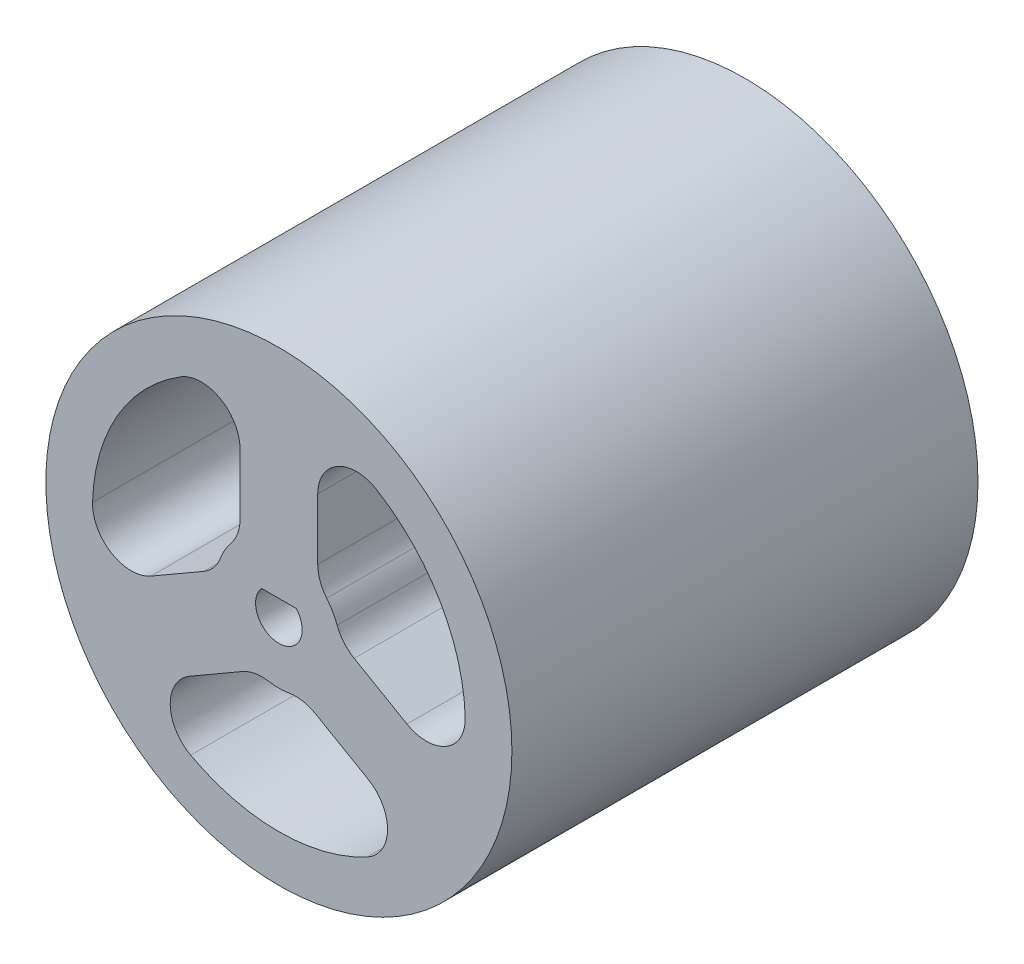
ISO-10303-21;
HEADER;
FILE_DESCRIPTION(('STEP AP214'),'2;1');
FILE_NAME('part.step','',(''),(''),'','','');
FILE_SCHEMA(('AUTOMOTIVE_DESIGN { 1 0 10303 214 1 1 1 1 }'));
ENDSEC;
DATA;
#1=APPLICATION_CONTEXT('core data for automotive mechanical design processes');
#2=APPLICATION_PROTOCOL_DEFINITION('international standard','automotive_design',2000,#1);
#3=PRODUCT_CONTEXT('',#1,'mechanical');
#4=PRODUCT('Part','Part','',(#3));
#5=PRODUCT_RELATED_PRODUCT_CATEGORY('part','',(#4));
#6=PRODUCT_DEFINITION_FORMATION('','',#4);
#7=PRODUCT_DEFINITION_CONTEXT('part definition',#1,'design');
#8=PRODUCT_DEFINITION('design','',#6,#7);
#9=PRODUCT_DEFINITION_SHAPE('','',#8);
#10=(LENGTH_UNIT() NAMED_UNIT(*) SI_UNIT(.MILLI.,.METRE.));
#11=(NAMED_UNIT(*) PLANE_ANGLE_UNIT() SI_UNIT($,.RADIAN.));
#12=(NAMED_UNIT(*) SI_UNIT($,.STERADIAN.) SOLID_ANGLE_UNIT());
#13=UNCERTAINTY_MEASURE_WITH_UNIT(LENGTH_MEASURE(1.E-05),#10,'distance_accuracy_value','');
#14=(GEOMETRIC_REPRESENTATION_CONTEXT(3) GLOBAL_UNCERTAINTY_ASSIGNED_CONTEXT((#13)) GLOBAL_UNIT_ASSIGNED_CONTEXT((#10,
#11,#12)) REPRESENTATION_CONTEXT('',''));
#15=CARTESIAN_POINT('',(0.,0.,0.));
#16=DIRECTION('',(0.,0.,1.));
#17=DIRECTION('',(1.,0.,0.));
#18=AXIS2_PLACEMENT_3D('',#15,#16,#17);
#19=CARTESIAN_POINT('',(0.,0.,60.));
#20=DIRECTION('',(0.,0.,1.));
#21=DIRECTION('',(1.,0.,0.));
#22=AXIS2_PLACEMENT_3D('',#19,#20,#21);
#23=PLANE('',#22);
#24=DIRECTION('',(-0.86602540378443,-0.500000000000014,0.));
#25=VECTOR('',#24,1.);
#26=CARTESIAN_POINT('',(2.49999999999999,-4.33012701892201,60.));
#27=LINE('',#26,#25);
#28=CARTESIAN_POINT('',(-4.6937472849692,-8.48343895038127,60.));
#29=VERTEX_POINT('',#28);
#30=CARTESIAN_POINT('',(-11.4910685796332,-12.407874229624,60.));
#31=VERTEX_POINT('',#30);
#32=EDGE_CURVE('E560',#29,#31,#27,.T.);
#33=ORIENTED_EDGE('',*,*,#32,.F.);
#34=CARTESIAN_POINT('',(-2.19374728496912,-12.8135659693034,60.));
#35=DIRECTION('',(0.,0.,1.));
#36=DIRECTION('',(1.,0.,0.));
#37=AXIS2_PLACEMENT_3D('',#34,#35,#36);
#38=CIRCLE('',#37,5.);
#39=CARTESIAN_POINT('',(-1.34999832921177,-7.88527136572518,60.));
#40=VERTEX_POINT('',#39);
#41=EDGE_CURVE('E348',#29,#40,#38,.F.);
#42=ORIENTED_EDGE('',*,*,#41,.T.);
#43=CARTESIAN_POINT('',(0.,0.,60.));
#44=DIRECTION('',(0.,0.,1.));
#45=DIRECTION('',(1.,0.,0.));
#46=AXIS2_PLACEMENT_3D('',#43,#44,#45);
#47=CIRCLE('',#46,8.);
#48=CARTESIAN_POINT('',(1.34999832921178,-7.88527136572518,60.));
#49=VERTEX_POINT('',#48);
#50=EDGE_CURVE('E570',#40,#49,#47,.T.);
#51=ORIENTED_EDGE('',*,*,#50,.T.);
#52=CARTESIAN_POINT('',(2.19374728496914,-12.8135659693034,60.));
#53=DIRECTION('',(0.,0.,1.));
#54=DIRECTION('',(1.,0.,0.));
#55=AXIS2_PLACEMENT_3D('',#52,#53,#54);
#56=CIRCLE('',#55,5.);
#57=CARTESIAN_POINT('',(4.69374728496899,-8.48343895038113,60.));
#58=VERTEX_POINT('',#57);
#59=EDGE_CURVE('E342',#49,#58,#56,.F.);
#60=ORIENTED_EDGE('',*,*,#59,.T.);
#61=DIRECTION('',(0.866025403784457,-0.499999999999969,0.));
#62=VECTOR('',#61,1.);
#63=CARTESIAN_POINT('',(-2.49999999999997,-4.3301270189225,60.));
#64=LINE('',#63,#62);
#65=CARTESIAN_POINT('',(11.4910685796334,-12.4078742296237,60.));
#66=VERTEX_POINT('',#65);
#67=EDGE_CURVE('E568',#58,#66,#64,.T.);
#68=ORIENTED_EDGE('',*,*,#67,.T.);
#69=CARTESIAN_POINT('',(8.99106857963356,-16.738001248546,60.));
#70=DIRECTION('',(0.,0.,1.));
#71=DIRECTION('',(1.,0.,0.));
#72=AXIS2_PLACEMENT_3D('',#69,#70,#71);
#73=CIRCLE('',#72,5.);
#74=CARTESIAN_POINT('',(11.3571392584845,-21.142738419216,60.));
#75=VERTEX_POINT('',#74);
#76=EDGE_CURVE('E384',#66,#75,#73,.F.);
#77=ORIENTED_EDGE('',*,*,#76,.T.);
#78=CARTESIAN_POINT('',(0.,0.,60.));
#79=DIRECTION('',(0.,0.,1.));
#80=DIRECTION('',(1.,0.,0.));
#81=AXIS2_PLACEMENT_3D('',#78,#79,#80);
#82=CIRCLE('',#81,24.);
#83=CARTESIAN_POINT('',(-11.3571392584839,-21.1427384192163,60.));
#84=VERTEX_POINT('',#83);
#85=EDGE_CURVE('E564',#84,#75,#82,.T.);
#86=ORIENTED_EDGE('',*,*,#85,.F.);
#87=CARTESIAN_POINT('',(-8.99106857963311,-16.7380012485462,60.));
#88=DIRECTION('',(0.,0.,1.));
#89=DIRECTION('',(1.,0.,0.));
#90=AXIS2_PLACEMENT_3D('',#87,#88,#89);
#91=CIRCLE('',#90,5.);
#92=EDGE_CURVE('E390',#84,#31,#91,.F.);
#93=ORIENTED_EDGE('',*,*,#92,.T.);
#94=EDGE_LOOP('',(#33,#42,#51,#60,#68,#77,#86,#93));
#95=FACE_BOUND('',#94,.T.);
#96=DIRECTION('',(0.866025403784456,-0.499999999999969,0.));
#97=VECTOR('',#96,1.);
#98=CARTESIAN_POINT('',(2.49999999999972,4.33012701892206,60.));
#99=LINE('',#98,#97);
#100=CARTESIAN_POINT('',(9.69374728496921,0.176815087463132,60.));
#101=VERTEX_POINT('',#100);
#102=CARTESIAN_POINT('',(16.4910685796334,-3.74762019177927,60.));
#103=VERTEX_POINT('',#102);
#104=EDGE_CURVE('E554',#101,#103,#99,.T.);
#105=ORIENTED_EDGE('',*,*,#104,.F.);
#106=CARTESIAN_POINT('',(12.1937472849691,4.50694210638541,60.));
#107=DIRECTION('',(0.,0.,1.));
#108=DIRECTION('',(1.,0.,0.));
#109=AXIS2_PLACEMENT_3D('',#106,#107,#108);
#110=CIRCLE('',#109,5.);
#111=CARTESIAN_POINT('',(7.50384448305788,2.77350283469872,60.));
#112=VERTEX_POINT('',#111);
#113=EDGE_CURVE('E372',#101,#112,#110,.F.);
#114=ORIENTED_EDGE('',*,*,#113,.T.);
#115=CARTESIAN_POINT('',(0.,0.,60.));
#116=DIRECTION('',(0.,0.,1.));
#117=DIRECTION('',(1.,0.,0.));
#118=AXIS2_PLACEMENT_3D('',#115,#116,#117);
#119=CIRCLE('',#118,8.);
#120=CARTESIAN_POINT('',(6.15384615384616,5.11176853102651,60.));
#121=VERTEX_POINT('',#120);
#122=EDGE_CURVE('E579',#112,#121,#119,.T.);
#123=ORIENTED_EDGE('',*,*,#122,.T.);
#124=CARTESIAN_POINT('',(10.,8.30662386291807,60.));
#125=DIRECTION('',(0.,0.,1.));
#126=DIRECTION('',(1.,0.,0.));
#127=AXIS2_PLACEMENT_3D('',#124,#125,#126);
#128=CIRCLE('',#127,5.);
#129=CARTESIAN_POINT('',(5.,8.30662386291807,60.));
#130=VERTEX_POINT('',#129);
#131=EDGE_CURVE('E366',#121,#130,#128,.F.);
#132=ORIENTED_EDGE('',*,*,#131,.T.);
#133=DIRECTION('',(0.,1.,0.));
#134=VECTOR('',#133,1.);
#135=CARTESIAN_POINT('',(5.,0.,60.));
#136=LINE('',#135,#134);
#137=CARTESIAN_POINT('',(5.,16.1554944214035,60.));
#138=VERTEX_POINT('',#137);
#139=EDGE_CURVE('E584',#130,#138,#136,.T.);
#140=ORIENTED_EDGE('',*,*,#139,.T.);
#141=CARTESIAN_POINT('',(10.,16.1554944214035,60.));
#142=DIRECTION('',(0.,0.,1.));
#143=DIRECTION('',(1.,0.,0.));
#144=AXIS2_PLACEMENT_3D('',#141,#142,#143);
#145=CIRCLE('',#144,5.);
#146=CARTESIAN_POINT('',(12.6315789473684,20.4069403217729,60.));
#147=VERTEX_POINT('',#146);
#148=EDGE_CURVE('E402',#138,#147,#145,.F.);
#149=ORIENTED_EDGE('',*,*,#148,.T.);
#150=CARTESIAN_POINT('',(0.,0.,60.));
#151=DIRECTION('',(0.,0.,1.));
#152=DIRECTION('',(1.,0.,0.));
#153=AXIS2_PLACEMENT_3D('',#150,#151,#152);
#154=CIRCLE('',#153,24.);
#155=CARTESIAN_POINT('',(23.9887182058525,0.735798097443807,60.));
#156=VERTEX_POINT('',#155);
#157=EDGE_CURVE('E588',#156,#147,#154,.T.);
#158=ORIENTED_EDGE('',*,*,#157,.F.);
#159=CARTESIAN_POINT('',(18.9910685796332,0.582506827143014,60.));
#160=DIRECTION('',(0.,0.,1.));
#161=DIRECTION('',(1.,0.,0.));
#162=AXIS2_PLACEMENT_3D('',#159,#160,#161);
#163=CIRCLE('',#162,5.);
#164=EDGE_CURVE('E378',#156,#103,#163,.F.);
#165=ORIENTED_EDGE('',*,*,#164,.T.);
#166=EDGE_LOOP('',(#105,#114,#123,#132,#140,#149,#158,#165));
#167=FACE_BOUND('',#166,.T.);
#168=DIRECTION('',(0.,1.,0.));
#169=VECTOR('',#168,1.);
#170=CARTESIAN_POINT('',(-5.,0.,60.));
#171=LINE('',#170,#169);
#172=CARTESIAN_POINT('',(-5.,8.30662386291808,60.));
#173=VERTEX_POINT('',#172);
#174=CARTESIAN_POINT('',(-5.,16.1554944214035,60.));
#175=VERTEX_POINT('',#174);
#176=EDGE_CURVE('E413',#173,#175,#171,.T.);
#177=ORIENTED_EDGE('',*,*,#176,.F.);
#178=CARTESIAN_POINT('',(-10.,8.30662386291808,60.));
#179=DIRECTION('',(0.,0.,1.));
#180=DIRECTION('',(1.,0.,0.));
#181=AXIS2_PLACEMENT_3D('',#178,#179,#180);
#182=CIRCLE('',#181,5.);
#183=CARTESIAN_POINT('',(-6.15384615384615,5.11176853102651,60.));
#184=VERTEX_POINT('',#183);
#185=EDGE_CURVE('E354',#173,#184,#182,.F.);
#186=ORIENTED_EDGE('',*,*,#185,.T.);
#187=CARTESIAN_POINT('',(0.,0.,60.));
#188=DIRECTION('',(0.,0.,1.));
#189=DIRECTION('',(1.,0.,0.));
#190=AXIS2_PLACEMENT_3D('',#187,#188,#189);
#191=CIRCLE('',#190,8.);
#192=CARTESIAN_POINT('',(-7.50384448305787,2.77350283469875,60.));
#193=VERTEX_POINT('',#192);
#194=EDGE_CURVE('E436',#184,#193,#191,.T.);
#195=ORIENTED_EDGE('',*,*,#194,.T.);
#196=CARTESIAN_POINT('',(-12.193747284969,4.50694210638546,60.));
#197=DIRECTION('',(0.,0.,1.));
#198=DIRECTION('',(1.,0.,0.));
#199=AXIS2_PLACEMENT_3D('',#196,#197,#198);
#200=CIRCLE('',#199,5.);
#201=CARTESIAN_POINT('',(-9.69374728496908,0.176815087463247,60.));
#202=VERTEX_POINT('',#201);
#203=EDGE_CURVE('E360',#193,#202,#200,.F.);
#204=ORIENTED_EDGE('',*,*,#203,.T.);
#205=DIRECTION('',(-0.866025403784443,-0.499999999999992,0.));
#206=VECTOR('',#205,1.);
#207=CARTESIAN_POINT('',(-2.49999999999996,4.33012701892222,60.));
#208=LINE('',#207,#206);
#209=CARTESIAN_POINT('',(-16.4910685796333,-3.74762019177941,60.));
#210=VERTEX_POINT('',#209);
#211=EDGE_CURVE('E445',#202,#210,#208,.T.);
#212=ORIENTED_EDGE('',*,*,#211,.T.);
#213=CARTESIAN_POINT('',(-18.9910685796332,0.582506827142809,60.));
#214=DIRECTION('',(0.,0.,1.));
#215=DIRECTION('',(1.,0.,0.));
#216=AXIS2_PLACEMENT_3D('',#213,#214,#215);
#217=CIRCLE('',#216,5.);
#218=CARTESIAN_POINT('',(-23.9887182058525,0.735798097443548,60.));
#219=VERTEX_POINT('',#218);
#220=EDGE_CURVE('E396',#210,#219,#217,.F.);
#221=ORIENTED_EDGE('',*,*,#220,.T.);
#222=CARTESIAN_POINT('',(0.,0.,60.));
#223=DIRECTION('',(0.,0.,1.));
#224=DIRECTION('',(1.,0.,0.));
#225=AXIS2_PLACEMENT_3D('',#222,#223,#224);
#226=CIRCLE('',#225,24.);
#227=CARTESIAN_POINT('',(-12.6315789473684,20.4069403217729,60.));
#228=VERTEX_POINT('',#227);
#229=EDGE_CURVE('E414',#228,#219,#226,.T.);
#230=ORIENTED_EDGE('',*,*,#229,.F.);
#231=CARTESIAN_POINT('',(-10.,16.1554944214035,60.));
#232=DIRECTION('',(0.,0.,1.));
#233=DIRECTION('',(1.,0.,0.));
#234=AXIS2_PLACEMENT_3D('',#231,#232,#233);
#235=CIRCLE('',#234,5.);
#236=EDGE_CURVE('E54',#228,#175,#235,.F.);
#237=ORIENTED_EDGE('',*,*,#236,.T.);
#238=EDGE_LOOP('',(#177,#186,#195,#204,#212,#221,#230,#237));
#239=FACE_BOUND('',#238,.T.);
#240=CARTESIAN_POINT('',(0.,0.,60.));
#241=DIRECTION('',(0.,0.,1.));
#242=DIRECTION('',(1.,0.,0.));
#243=AXIS2_PLACEMENT_3D('',#240,#241,#242);
#244=CIRCLE('',#243,30.);
#245=CARTESIAN_POINT('',(30.,0.,60.));
#246=VERTEX_POINT('',#245);
#247=EDGE_CURVE('E247',#246,#246,#244,.T.);
#248=ORIENTED_EDGE('',*,*,#247,.T.);
#249=EDGE_LOOP('',(#248));
#250=FACE_BOUND('',#249,.T.);
#251=CARTESIAN_POINT('',(0.,0.,60.));
#252=DIRECTION('',(0.,0.,1.));
#253=DIRECTION('',(1.,0.,0.));
#254=AXIS2_PLACEMENT_3D('',#251,#252,#253);
#255=CIRCLE('',#254,3.);
#256=CARTESIAN_POINT('',(-2.22436752780713,2.01300499284954,60.));
#257=VERTEX_POINT('',#256);
#258=CARTESIAN_POINT('',(2.22436752780713,2.01300499284954,60.));
#259=VERTEX_POINT('',#258);
#260=EDGE_CURVE('E251',#257,#259,#255,.T.);
#261=ORIENTED_EDGE('',*,*,#260,.F.);
#262=DIRECTION('',(1.,0.,0.));
#263=VECTOR('',#262,1.);
#264=CARTESIAN_POINT('',(0.,2.01300499284954,60.));
#265=LINE('',#264,#263);
#266=EDGE_CURVE('E225',#257,#259,#265,.T.);
#267=ORIENTED_EDGE('',*,*,#266,.T.);
#268=EDGE_LOOP('',(#261,#267));
#269=FACE_BOUND('',#268,.T.);
#270=ADVANCED_FACE('F45',(#95,#167,#239,#250,#269),#23,.T.);
#271=CARTESIAN_POINT('',(0.,0.,60.));
#272=DIRECTION('',(0.,0.,-1.));
#273=DIRECTION('',(-1.,0.,0.));
#274=AXIS2_PLACEMENT_3D('',#271,#272,#273);
#275=CYLINDRICAL_SURFACE('',#274,30.);
#276=ORIENTED_EDGE('',*,*,#247,.F.);
#277=EDGE_LOOP('',(#276));
#278=FACE_BOUND('',#277,.T.);
#279=CARTESIAN_POINT('',(0.,0.,0.));
#280=DIRECTION('',(0.,0.,1.));
#281=DIRECTION('',(1.,0.,0.));
#282=AXIS2_PLACEMENT_3D('',#279,#280,#281);
#283=CIRCLE('',#282,30.);
#284=CARTESIAN_POINT('',(30.,0.,0.));
#285=VERTEX_POINT('',#284);
#286=EDGE_CURVE('E246',#285,#285,#283,.T.);
#287=ORIENTED_EDGE('',*,*,#286,.T.);
#288=EDGE_LOOP('',(#287));
#289=FACE_BOUND('',#288,.T.);
#290=ADVANCED_FACE('F485',(#278,#289),#275,.T.);
#291=CARTESIAN_POINT('',(0.,0.,0.));
#292=DIRECTION('',(0.,0.,1.));
#293=DIRECTION('',(1.,0.,0.));
#294=AXIS2_PLACEMENT_3D('',#291,#292,#293);
#295=PLANE('',#294);
#296=CARTESIAN_POINT('',(0.,0.,0.));
#297=DIRECTION('',(0.,0.,1.));
#298=DIRECTION('',(1.,0.,0.));
#299=AXIS2_PLACEMENT_3D('',#296,#297,#298);
#300=CIRCLE('',#299,8.);
#301=CARTESIAN_POINT('',(-1.34999832921177,-7.88527136572518,0.));
#302=VERTEX_POINT('',#301);
#303=CARTESIAN_POINT('',(1.34999832921178,-7.88527136572518,0.));
#304=VERTEX_POINT('',#303);
#305=EDGE_CURVE('E549',#302,#304,#300,.T.);
#306=ORIENTED_EDGE('',*,*,#305,.F.);
#307=CARTESIAN_POINT('',(-2.19374728496912,-12.8135659693034,0.));
#308=DIRECTION('',(0.,0.,1.));
#309=DIRECTION('',(1.,0.,0.));
#310=AXIS2_PLACEMENT_3D('',#307,#308,#309);
#311=CIRCLE('',#310,5.);
#312=CARTESIAN_POINT('',(-4.6937472849692,-8.48343895038127,0.));
#313=VERTEX_POINT('',#312);
#314=EDGE_CURVE('E351',#302,#313,#311,.T.);
#315=ORIENTED_EDGE('',*,*,#314,.T.);
#316=DIRECTION('',(-0.86602540378443,-0.500000000000014,0.));
#317=VECTOR('',#316,1.);
#318=CARTESIAN_POINT('',(2.49999999999999,-4.33012701892201,0.));
#319=LINE('',#318,#317);
#320=CARTESIAN_POINT('',(-11.4910685796332,-12.407874229624,0.));
#321=VERTEX_POINT('',#320);
#322=EDGE_CURVE('E556',#313,#321,#319,.T.);
#323=ORIENTED_EDGE('',*,*,#322,.T.);
#324=CARTESIAN_POINT('',(-8.99106857963311,-16.7380012485462,0.));
#325=DIRECTION('',(0.,0.,1.));
#326=DIRECTION('',(1.,0.,0.));
#327=AXIS2_PLACEMENT_3D('',#324,#325,#326);
#328=CIRCLE('',#327,5.);
#329=CARTESIAN_POINT('',(-11.3571392584839,-21.1427384192163,0.));
#330=VERTEX_POINT('',#329);
#331=EDGE_CURVE('E393',#321,#330,#328,.T.);
#332=ORIENTED_EDGE('',*,*,#331,.T.);
#333=CARTESIAN_POINT('',(0.,0.,0.));
#334=DIRECTION('',(0.,0.,1.));
#335=DIRECTION('',(1.,0.,0.));
#336=AXIS2_PLACEMENT_3D('',#333,#334,#335);
#337=CIRCLE('',#336,24.);
#338=CARTESIAN_POINT('',(11.3571392584845,-21.142738419216,0.));
#339=VERTEX_POINT('',#338);
#340=EDGE_CURVE('E542',#330,#339,#337,.T.);
#341=ORIENTED_EDGE('',*,*,#340,.T.);
#342=CARTESIAN_POINT('',(8.99106857963356,-16.738001248546,0.));
#343=DIRECTION('',(0.,0.,1.));
#344=DIRECTION('',(1.,0.,0.));
#345=AXIS2_PLACEMENT_3D('',#342,#343,#344);
#346=CIRCLE('',#345,5.);
#347=CARTESIAN_POINT('',(11.4910685796334,-12.4078742296237,0.));
#348=VERTEX_POINT('',#347);
#349=EDGE_CURVE('E387',#339,#348,#346,.T.);
#350=ORIENTED_EDGE('',*,*,#349,.T.);
#351=DIRECTION('',(0.866025403784457,-0.499999999999969,0.));
#352=VECTOR('',#351,1.);
#353=CARTESIAN_POINT('',(-2.49999999999997,-4.3301270189225,0.));
#354=LINE('',#353,#352);
#355=CARTESIAN_POINT('',(4.69374728496899,-8.48343895038113,0.));
#356=VERTEX_POINT('',#355);
#357=EDGE_CURVE('E539',#356,#348,#354,.T.);
#358=ORIENTED_EDGE('',*,*,#357,.F.);
#359=CARTESIAN_POINT('',(2.19374728496914,-12.8135659693034,0.));
#360=DIRECTION('',(0.,0.,1.));
#361=DIRECTION('',(1.,0.,0.));
#362=AXIS2_PLACEMENT_3D('',#359,#360,#361);
#363=CIRCLE('',#362,5.);
#364=EDGE_CURVE('E345',#356,#304,#363,.T.);
#365=ORIENTED_EDGE('',*,*,#364,.T.);
#366=EDGE_LOOP('',(#306,#315,#323,#332,#341,#350,#358,#365));
#367=FACE_BOUND('',#366,.T.);
#368=CARTESIAN_POINT('',(0.,0.,0.));
#369=DIRECTION('',(0.,0.,1.));
#370=DIRECTION('',(1.,0.,0.));
#371=AXIS2_PLACEMENT_3D('',#368,#369,#370);
#372=CIRCLE('',#371,8.);
#373=CARTESIAN_POINT('',(7.50384448305788,2.77350283469872,0.));
#374=VERTEX_POINT('',#373);
#375=CARTESIAN_POINT('',(6.15384615384616,5.11176853102651,0.));
#376=VERTEX_POINT('',#375);
#377=EDGE_CURVE('E423',#374,#376,#372,.T.);
#378=ORIENTED_EDGE('',*,*,#377,.F.);
#379=CARTESIAN_POINT('',(12.1937472849691,4.50694210638541,0.));
#380=DIRECTION('',(0.,0.,1.));
#381=DIRECTION('',(1.,0.,0.));
#382=AXIS2_PLACEMENT_3D('',#379,#380,#381);
#383=CIRCLE('',#382,5.);
#384=CARTESIAN_POINT('',(9.69374728496921,0.176815087463132,0.));
#385=VERTEX_POINT('',#384);
#386=EDGE_CURVE('E375',#374,#385,#383,.T.);
#387=ORIENTED_EDGE('',*,*,#386,.T.);
#388=DIRECTION('',(0.866025403784456,-0.499999999999969,0.));
#389=VECTOR('',#388,1.);
#390=CARTESIAN_POINT('',(2.49999999999972,4.33012701892206,0.));
#391=LINE('',#390,#389);
#392=CARTESIAN_POINT('',(16.4910685796334,-3.74762019177927,0.));
#393=VERTEX_POINT('',#392);
#394=EDGE_CURVE('E583',#385,#393,#391,.T.);
#395=ORIENTED_EDGE('',*,*,#394,.T.);
#396=CARTESIAN_POINT('',(18.9910685796332,0.582506827143014,0.));
#397=DIRECTION('',(0.,0.,1.));
#398=DIRECTION('',(1.,0.,0.));
#399=AXIS2_PLACEMENT_3D('',#396,#397,#398);
#400=CIRCLE('',#399,5.);
#401=CARTESIAN_POINT('',(23.9887182058525,0.735798097443807,0.));
#402=VERTEX_POINT('',#401);
#403=EDGE_CURVE('E381',#393,#402,#400,.T.);
#404=ORIENTED_EDGE('',*,*,#403,.T.);
#405=CARTESIAN_POINT('',(0.,0.,0.));
#406=DIRECTION('',(0.,0.,1.));
#407=DIRECTION('',(1.,0.,0.));
#408=AXIS2_PLACEMENT_3D('',#405,#406,#407);
#409=CIRCLE('',#408,24.);
#410=CARTESIAN_POINT('',(12.6315789473684,20.4069403217729,0.));
#411=VERTEX_POINT('',#410);
#412=EDGE_CURVE('E602',#402,#411,#409,.T.);
#413=ORIENTED_EDGE('',*,*,#412,.T.);
#414=CARTESIAN_POINT('',(10.,16.1554944214035,0.));
#415=DIRECTION('',(0.,0.,1.));
#416=DIRECTION('',(1.,0.,0.));
#417=AXIS2_PLACEMENT_3D('',#414,#415,#416);
#418=CIRCLE('',#417,5.);
#419=CARTESIAN_POINT('',(5.,16.1554944214035,0.));
#420=VERTEX_POINT('',#419);
#421=EDGE_CURVE('E405',#411,#420,#418,.T.);
#422=ORIENTED_EDGE('',*,*,#421,.T.);
#423=DIRECTION('',(0.,1.,0.));
#424=VECTOR('',#423,1.);
#425=CARTESIAN_POINT('',(5.,0.,0.));
#426=LINE('',#425,#424);
#427=CARTESIAN_POINT('',(5.,8.30662386291807,0.));
#428=VERTEX_POINT('',#427);
#429=EDGE_CURVE('E598',#428,#420,#426,.T.);
#430=ORIENTED_EDGE('',*,*,#429,.F.);
#431=CARTESIAN_POINT('',(10.,8.30662386291807,0.));
#432=DIRECTION('',(0.,0.,1.));
#433=DIRECTION('',(1.,0.,0.));
#434=AXIS2_PLACEMENT_3D('',#431,#432,#433);
#435=CIRCLE('',#434,5.);
#436=EDGE_CURVE('E369',#428,#376,#435,.T.);
#437=ORIENTED_EDGE('',*,*,#436,.T.);
#438=EDGE_LOOP('',(#378,#387,#395,#404,#413,#422,#430,#437));
#439=FACE_BOUND('',#438,.T.);
#440=CARTESIAN_POINT('',(0.,0.,0.));
#441=DIRECTION('',(0.,0.,1.));
#442=DIRECTION('',(1.,0.,0.));
#443=AXIS2_PLACEMENT_3D('',#440,#441,#442);
#444=CIRCLE('',#443,8.);
#445=CARTESIAN_POINT('',(-6.15384615384615,5.11176853102651,0.));
#446=VERTEX_POINT('',#445);
#447=CARTESIAN_POINT('',(-7.50384448305787,2.77350283469875,0.));
#448=VERTEX_POINT('',#447);
#449=EDGE_CURVE('E237',#446,#448,#444,.T.);
#450=ORIENTED_EDGE('',*,*,#449,.F.);
#451=CARTESIAN_POINT('',(-10.,8.30662386291808,0.));
#452=DIRECTION('',(0.,0.,1.));
#453=DIRECTION('',(1.,0.,0.));
#454=AXIS2_PLACEMENT_3D('',#451,#452,#453);
#455=CIRCLE('',#454,5.);
#456=CARTESIAN_POINT('',(-5.,8.30662386291808,0.));
#457=VERTEX_POINT('',#456);
#458=EDGE_CURVE('E357',#446,#457,#455,.T.);
#459=ORIENTED_EDGE('',*,*,#458,.T.);
#460=DIRECTION('',(0.,1.,0.));
#461=VECTOR('',#460,1.);
#462=CARTESIAN_POINT('',(-5.,0.,0.));
#463=LINE('',#462,#461);
#464=CARTESIAN_POINT('',(-5.,16.1554944214035,0.));
#465=VERTEX_POINT('',#464);
#466=EDGE_CURVE('E430',#457,#465,#463,.T.);
#467=ORIENTED_EDGE('',*,*,#466,.T.);
#468=CARTESIAN_POINT('',(-10.,16.1554944214035,0.));
#469=DIRECTION('',(0.,0.,1.));
#470=DIRECTION('',(1.,0.,0.));
#471=AXIS2_PLACEMENT_3D('',#468,#469,#470);
#472=CIRCLE('',#471,5.);
#473=CARTESIAN_POINT('',(-12.6315789473684,20.4069403217729,0.));
#474=VERTEX_POINT('',#473);
#475=EDGE_CURVE('E11',#465,#474,#472,.T.);
#476=ORIENTED_EDGE('',*,*,#475,.T.);
#477=CARTESIAN_POINT('',(0.,0.,0.));
#478=DIRECTION('',(0.,0.,1.));
#479=DIRECTION('',(1.,0.,0.));
#480=AXIS2_PLACEMENT_3D('',#477,#478,#479);
#481=CIRCLE('',#480,24.);
#482=CARTESIAN_POINT('',(-23.9887182058525,0.735798097443548,0.));
#483=VERTEX_POINT('',#482);
#484=EDGE_CURVE('E426',#474,#483,#481,.T.);
#485=ORIENTED_EDGE('',*,*,#484,.T.);
#486=CARTESIAN_POINT('',(-18.9910685796332,0.582506827142809,0.));
#487=DIRECTION('',(0.,0.,1.));
#488=DIRECTION('',(1.,0.,0.));
#489=AXIS2_PLACEMENT_3D('',#486,#487,#488);
#490=CIRCLE('',#489,5.);
#491=CARTESIAN_POINT('',(-16.4910685796333,-3.74762019177941,0.));
#492=VERTEX_POINT('',#491);
#493=EDGE_CURVE('E399',#483,#492,#490,.T.);
#494=ORIENTED_EDGE('',*,*,#493,.T.);
#495=DIRECTION('',(-0.866025403784443,-0.499999999999992,0.));
#496=VECTOR('',#495,1.);
#497=CARTESIAN_POINT('',(-2.49999999999996,4.33012701892222,0.));
#498=LINE('',#497,#496);
#499=CARTESIAN_POINT('',(-9.69374728496908,0.176815087463247,0.));
#500=VERTEX_POINT('',#499);
#501=EDGE_CURVE('E429',#500,#492,#498,.T.);
#502=ORIENTED_EDGE('',*,*,#501,.F.);
#503=CARTESIAN_POINT('',(-12.193747284969,4.50694210638546,0.));
#504=DIRECTION('',(0.,0.,1.));
#505=DIRECTION('',(1.,0.,0.));
#506=AXIS2_PLACEMENT_3D('',#503,#504,#505);
#507=CIRCLE('',#506,5.);
#508=EDGE_CURVE('E363',#500,#448,#507,.T.);
#509=ORIENTED_EDGE('',*,*,#508,.T.);
#510=EDGE_LOOP('',(#450,#459,#467,#476,#485,#494,#502,#509));
#511=FACE_BOUND('',#510,.T.);
#512=ORIENTED_EDGE('',*,*,#286,.F.);
#513=EDGE_LOOP('',(#512));
#514=FACE_BOUND('',#513,.T.);
#515=ADVANCED_FACE('F460',(#367,#439,#511,#514),#295,.F.);
#516=CARTESIAN_POINT('',(0.,2.01300499284954,47.));
#517=DIRECTION('',(0.,-1.,0.));
#518=DIRECTION('',(0.,0.,-1.));
#519=AXIS2_PLACEMENT_3D('',#516,#517,#518);
#520=PLANE('',#519);
#521=DIRECTION('',(0.,0.,1.));
#522=VECTOR('',#521,1.);
#523=CARTESIAN_POINT('',(-2.22436752780713,2.01300499284954,47.));
#524=LINE('',#523,#522);
#525=CARTESIAN_POINT('',(-2.22436752780713,2.01300499284954,47.));
#526=VERTEX_POINT('',#525);
#527=EDGE_CURVE('E218',#526,#257,#524,.T.);
#528=ORIENTED_EDGE('',*,*,#527,.F.);
#529=DIRECTION('',(1.,0.,0.));
#530=VECTOR('',#529,1.);
#531=CARTESIAN_POINT('',(0.,2.01300499284954,47.));
#532=LINE('',#531,#530);
#533=CARTESIAN_POINT('',(2.22436752780713,2.01300499284954,47.));
#534=VERTEX_POINT('',#533);
#535=EDGE_CURVE('E222',#526,#534,#532,.T.);
#536=ORIENTED_EDGE('',*,*,#535,.T.);
#537=DIRECTION('',(0.,0.,1.));
#538=VECTOR('',#537,1.);
#539=CARTESIAN_POINT('',(2.22436752780713,2.01300499284954,47.));
#540=LINE('',#539,#538);
#541=EDGE_CURVE('E230',#534,#259,#540,.T.);
#542=ORIENTED_EDGE('',*,*,#541,.T.);
#543=ORIENTED_EDGE('',*,*,#266,.F.);
#544=EDGE_LOOP('',(#528,#536,#542,#543));
#545=FACE_BOUND('',#544,.T.);
#546=ADVANCED_FACE('F220',(#545),#520,.T.);
#547=CARTESIAN_POINT('',(0.,0.,47.));
#548=DIRECTION('',(0.,0.,1.));
#549=DIRECTION('',(1.,0.,0.));
#550=AXIS2_PLACEMENT_3D('',#547,#548,#549);
#551=CYLINDRICAL_SURFACE('',#550,3.);
#552=ORIENTED_EDGE('',*,*,#260,.T.);
#553=ORIENTED_EDGE('',*,*,#541,.F.);
#554=CARTESIAN_POINT('',(0.,0.,47.));
#555=DIRECTION('',(0.,0.,1.));
#556=DIRECTION('',(1.,0.,0.));
#557=AXIS2_PLACEMENT_3D('',#554,#555,#556);
#558=CIRCLE('',#557,3.);
#559=EDGE_CURVE('E231',#526,#534,#558,.T.);
#560=ORIENTED_EDGE('',*,*,#559,.F.);
#561=ORIENTED_EDGE('',*,*,#527,.T.);
#562=EDGE_LOOP('',(#552,#553,#560,#561));
#563=FACE_BOUND('',#562,.T.);
#564=ADVANCED_FACE('F239',(#563),#551,.F.);
#565=CARTESIAN_POINT('',(0.,0.,47.));
#566=DIRECTION('',(0.,0.,1.));
#567=DIRECTION('',(1.,0.,0.));
#568=AXIS2_PLACEMENT_3D('',#565,#566,#567);
#569=PLANE('',#568);
#570=ORIENTED_EDGE('',*,*,#535,.F.);
#571=ORIENTED_EDGE('',*,*,#559,.T.);
#572=EDGE_LOOP('',(#570,#571));
#573=FACE_BOUND('',#572,.T.);
#574=ADVANCED_FACE('F235',(#573),#569,.T.);
#575=CARTESIAN_POINT('',(-5.,0.,0.));
#576=DIRECTION('',(1.,0.,0.));
#577=DIRECTION('',(0.,0.,-1.));
#578=AXIS2_PLACEMENT_3D('',#575,#576,#577);
#579=PLANE('',#578);
#580=ORIENTED_EDGE('',*,*,#466,.F.);
#581=DIRECTION('',(0.,0.,1.));
#582=VECTOR('',#581,1.);
#583=CARTESIAN_POINT('',(-5.,8.30662386291808,0.));
#584=LINE('',#583,#582);
#585=EDGE_CURVE('E283',#457,#173,#584,.T.);
#586=ORIENTED_EDGE('',*,*,#585,.T.);
#587=ORIENTED_EDGE('',*,*,#176,.T.);
#588=DIRECTION('',(0.,0.,-1.));
#589=VECTOR('',#588,1.);
#590=CARTESIAN_POINT('',(-5.,16.1554944214035,0.));
#591=LINE('',#590,#589);
#592=EDGE_CURVE('E280',#175,#465,#591,.T.);
#593=ORIENTED_EDGE('',*,*,#592,.T.);
#594=EDGE_LOOP('',(#580,#586,#587,#593));
#595=FACE_BOUND('',#594,.T.);
#596=ADVANCED_FACE('F420',(#595),#579,.F.);
#597=CARTESIAN_POINT('',(0.,0.,0.));
#598=DIRECTION('',(0.,0.,1.));
#599=DIRECTION('',(1.,0.,0.));
#600=AXIS2_PLACEMENT_3D('',#597,#598,#599);
#601=CYLINDRICAL_SURFACE('',#600,8.);
#602=ORIENTED_EDGE('',*,*,#194,.F.);
#603=DIRECTION('',(0.,0.,1.));
#604=VECTOR('',#603,1.);
#605=CARTESIAN_POINT('',(-6.15384615384615,5.11176853102651,0.));
#606=LINE('',#605,#604);
#607=EDGE_CURVE('E291',#184,#446,#606,.F.);
#608=ORIENTED_EDGE('',*,*,#607,.T.);
#609=ORIENTED_EDGE('',*,*,#449,.T.);
#610=DIRECTION('',(0.,0.,1.));
#611=VECTOR('',#610,1.);
#612=CARTESIAN_POINT('',(-7.50384448305787,2.77350283469875,0.));
#613=LINE('',#612,#611);
#614=EDGE_CURVE('E287',#448,#193,#613,.T.);
#615=ORIENTED_EDGE('',*,*,#614,.T.);
#616=EDGE_LOOP('',(#602,#608,#609,#615));
#617=FACE_BOUND('',#616,.T.);
#618=ADVANCED_FACE('F454',(#617),#601,.T.);
#619=CARTESIAN_POINT('',(-2.49999999999996,4.33012701892222,0.));
#620=DIRECTION('',(-0.499999999999992,0.866025403784443,0.));
#621=DIRECTION('',(-0.866025403784443,-0.499999999999992,0.));
#622=AXIS2_PLACEMENT_3D('',#619,#620,#621);
#623=PLANE('',#622);
#624=ORIENTED_EDGE('',*,*,#211,.F.);
#625=DIRECTION('',(0.,0.,-1.));
#626=VECTOR('',#625,1.);
#627=CARTESIAN_POINT('',(-9.69374728496908,0.176815087463248,0.));
#628=LINE('',#627,#626);
#629=EDGE_CURVE('E298',#202,#500,#628,.T.);
#630=ORIENTED_EDGE('',*,*,#629,.T.);
#631=ORIENTED_EDGE('',*,*,#501,.T.);
#632=DIRECTION('',(0.,0.,1.));
#633=VECTOR('',#632,1.);
#634=CARTESIAN_POINT('',(-16.4910685796333,-3.74762019177941,0.));
#635=LINE('',#634,#633);
#636=EDGE_CURVE('E294',#492,#210,#635,.T.);
#637=ORIENTED_EDGE('',*,*,#636,.T.);
#638=EDGE_LOOP('',(#624,#630,#631,#637));
#639=FACE_BOUND('',#638,.T.);
#640=ADVANCED_FACE('F468',(#639),#623,.T.);
#641=CARTESIAN_POINT('',(0.,0.,0.));
#642=DIRECTION('',(0.,0.,1.));
#643=DIRECTION('',(1.,0.,0.));
#644=AXIS2_PLACEMENT_3D('',#641,#642,#643);
#645=CYLINDRICAL_SURFACE('',#644,24.);
#646=ORIENTED_EDGE('',*,*,#229,.T.);
#647=DIRECTION('',(0.,0.,1.));
#648=VECTOR('',#647,1.);
#649=CARTESIAN_POINT('',(-23.9887182058525,0.735798097443548,0.));
#650=LINE('',#649,#648);
#651=EDGE_CURVE('E61',#219,#483,#650,.F.);
#652=ORIENTED_EDGE('',*,*,#651,.T.);
#653=ORIENTED_EDGE('',*,*,#484,.F.);
#654=DIRECTION('',(0.,0.,1.));
#655=VECTOR('',#654,1.);
#656=CARTESIAN_POINT('',(-12.6315789473684,20.4069403217729,0.));
#657=LINE('',#656,#655);
#658=EDGE_CURVE('E336',#474,#228,#657,.T.);
#659=ORIENTED_EDGE('',*,*,#658,.T.);
#660=EDGE_LOOP('',(#646,#652,#653,#659));
#661=FACE_BOUND('',#660,.T.);
#662=ADVANCED_FACE('F425',(#661),#645,.F.);
#663=CARTESIAN_POINT('',(2.49999999999972,4.33012701892206,0.));
#664=DIRECTION('',(-0.499999999999969,-0.866025403784456,0.));
#665=DIRECTION('',(0.866025403784456,-0.499999999999969,0.));
#666=AXIS2_PLACEMENT_3D('',#663,#664,#665);
#667=PLANE('',#666);
#668=ORIENTED_EDGE('',*,*,#394,.F.);
#669=DIRECTION('',(0.,0.,1.));
#670=VECTOR('',#669,1.);
#671=CARTESIAN_POINT('',(9.69374728496921,0.176815087463132,0.));
#672=LINE('',#671,#670);
#673=EDGE_CURVE('E318',#385,#101,#672,.T.);
#674=ORIENTED_EDGE('',*,*,#673,.T.);
#675=ORIENTED_EDGE('',*,*,#104,.T.);
#676=DIRECTION('',(0.,0.,-1.));
#677=VECTOR('',#676,1.);
#678=CARTESIAN_POINT('',(16.4910685796334,-3.74762019177927,0.));
#679=LINE('',#678,#677);
#680=EDGE_CURVE('E315',#103,#393,#679,.T.);
#681=ORIENTED_EDGE('',*,*,#680,.T.);
#682=EDGE_LOOP('',(#668,#674,#675,#681));
#683=FACE_BOUND('',#682,.T.);
#684=ADVANCED_FACE('F635',(#683),#667,.F.);
#685=CARTESIAN_POINT('',(0.,0.,0.));
#686=DIRECTION('',(0.,0.,1.));
#687=DIRECTION('',(1.,0.,0.));
#688=AXIS2_PLACEMENT_3D('',#685,#686,#687);
#689=CYLINDRICAL_SURFACE('',#688,8.);
#690=ORIENTED_EDGE('',*,*,#377,.T.);
#691=DIRECTION('',(0.,0.,1.));
#692=VECTOR('',#691,1.);
#693=CARTESIAN_POINT('',(6.15384615384616,5.11176853102651,0.));
#694=LINE('',#693,#692);
#695=EDGE_CURVE('E304',#376,#121,#694,.T.);
#696=ORIENTED_EDGE('',*,*,#695,.T.);
#697=ORIENTED_EDGE('',*,*,#122,.F.);
#698=DIRECTION('',(0.,0.,1.));
#699=VECTOR('',#698,1.);
#700=CARTESIAN_POINT('',(7.50384448305788,2.77350283469872,0.));
#701=LINE('',#700,#699);
#702=EDGE_CURVE('E301',#112,#374,#701,.F.);
#703=ORIENTED_EDGE('',*,*,#702,.T.);
#704=EDGE_LOOP('',(#690,#696,#697,#703));
#705=FACE_BOUND('',#704,.T.);
#706=ADVANCED_FACE('F633',(#705),#689,.T.);
#707=CARTESIAN_POINT('',(5.,0.,0.));
#708=DIRECTION('',(1.,0.,0.));
#709=DIRECTION('',(0.,0.,-1.));
#710=AXIS2_PLACEMENT_3D('',#707,#708,#709);
#711=PLANE('',#710);
#712=ORIENTED_EDGE('',*,*,#139,.F.);
#713=DIRECTION('',(0.,0.,-1.));
#714=VECTOR('',#713,1.);
#715=CARTESIAN_POINT('',(5.,8.30662386291807,0.));
#716=LINE('',#715,#714);
#717=EDGE_CURVE('E312',#130,#428,#716,.T.);
#718=ORIENTED_EDGE('',*,*,#717,.T.);
#719=ORIENTED_EDGE('',*,*,#429,.T.);
#720=DIRECTION('',(0.,0.,1.));
#721=VECTOR('',#720,1.);
#722=CARTESIAN_POINT('',(5.,16.1554944214035,0.));
#723=LINE('',#722,#721);
#724=EDGE_CURVE('E308',#420,#138,#723,.T.);
#725=ORIENTED_EDGE('',*,*,#724,.T.);
#726=EDGE_LOOP('',(#712,#718,#719,#725));
#727=FACE_BOUND('',#726,.T.);
#728=ADVANCED_FACE('F626',(#727),#711,.T.);
#729=CARTESIAN_POINT('',(0.,0.,0.));
#730=DIRECTION('',(0.,0.,1.));
#731=DIRECTION('',(1.,0.,0.));
#732=AXIS2_PLACEMENT_3D('',#729,#730,#731);
#733=CYLINDRICAL_SURFACE('',#732,24.);
#734=ORIENTED_EDGE('',*,*,#412,.F.);
#735=DIRECTION('',(0.,0.,1.));
#736=VECTOR('',#735,1.);
#737=CARTESIAN_POINT('',(23.9887182058525,0.735798097443807,0.));
#738=LINE('',#737,#736);
#739=EDGE_CURVE('E325',#402,#156,#738,.T.);
#740=ORIENTED_EDGE('',*,*,#739,.T.);
#741=ORIENTED_EDGE('',*,*,#157,.T.);
#742=DIRECTION('',(0.,0.,1.));
#743=VECTOR('',#742,1.);
#744=CARTESIAN_POINT('',(12.6315789473684,20.4069403217729,0.));
#745=LINE('',#744,#743);
#746=EDGE_CURVE('E322',#147,#411,#745,.F.);
#747=ORIENTED_EDGE('',*,*,#746,.T.);
#748=EDGE_LOOP('',(#734,#740,#741,#747));
#749=FACE_BOUND('',#748,.T.);
#750=ADVANCED_FACE('F619',(#749),#733,.F.);
#751=CARTESIAN_POINT('',(2.49999999999999,-4.33012701892201,0.));
#752=DIRECTION('',(-0.500000000000014,0.86602540378443,0.));
#753=DIRECTION('',(-0.86602540378443,-0.500000000000014,0.));
#754=AXIS2_PLACEMENT_3D('',#751,#752,#753);
#755=PLANE('',#754);
#756=ORIENTED_EDGE('',*,*,#322,.F.);
#757=DIRECTION('',(0.,0.,1.));
#758=VECTOR('',#757,1.);
#759=CARTESIAN_POINT('',(-4.6937472849692,-8.48343895038127,0.));
#760=LINE('',#759,#758);
#761=EDGE_CURVE('E276',#313,#29,#760,.T.);
#762=ORIENTED_EDGE('',*,*,#761,.T.);
#763=ORIENTED_EDGE('',*,*,#32,.T.);
#764=DIRECTION('',(0.,0.,-1.));
#765=VECTOR('',#764,1.);
#766=CARTESIAN_POINT('',(-11.4910685796332,-12.407874229624,0.));
#767=LINE('',#766,#765);
#768=EDGE_CURVE('E273',#31,#321,#767,.T.);
#769=ORIENTED_EDGE('',*,*,#768,.T.);
#770=EDGE_LOOP('',(#756,#762,#763,#769));
#771=FACE_BOUND('',#770,.T.);
#772=ADVANCED_FACE('F650',(#771),#755,.F.);
#773=CARTESIAN_POINT('',(0.,0.,0.));
#774=DIRECTION('',(0.,0.,1.));
#775=DIRECTION('',(1.,0.,0.));
#776=AXIS2_PLACEMENT_3D('',#773,#774,#775);
#777=CYLINDRICAL_SURFACE('',#776,8.);
#778=ORIENTED_EDGE('',*,*,#305,.T.);
#779=DIRECTION('',(0.,0.,1.));
#780=VECTOR('',#779,1.);
#781=CARTESIAN_POINT('',(1.34999832921178,-7.88527136572518,0.));
#782=LINE('',#781,#780);
#783=EDGE_CURVE('E262',#304,#49,#782,.T.);
#784=ORIENTED_EDGE('',*,*,#783,.T.);
#785=ORIENTED_EDGE('',*,*,#50,.F.);
#786=DIRECTION('',(0.,0.,1.));
#787=VECTOR('',#786,1.);
#788=CARTESIAN_POINT('',(-1.34999832921177,-7.88527136572518,0.));
#789=LINE('',#788,#787);
#790=EDGE_CURVE('E259',#40,#302,#789,.F.);
#791=ORIENTED_EDGE('',*,*,#790,.T.);
#792=EDGE_LOOP('',(#778,#784,#785,#791));
#793=FACE_BOUND('',#792,.T.);
#794=ADVANCED_FACE('F647',(#793),#777,.T.);
#795=CARTESIAN_POINT('',(-2.49999999999997,-4.3301270189225,0.));
#796=DIRECTION('',(-0.499999999999969,-0.866025403784457,0.));
#797=DIRECTION('',(0.866025403784457,-0.499999999999969,0.));
#798=AXIS2_PLACEMENT_3D('',#795,#796,#797);
#799=PLANE('',#798);
#800=ORIENTED_EDGE('',*,*,#67,.F.);
#801=DIRECTION('',(0.,0.,-1.));
#802=VECTOR('',#801,1.);
#803=CARTESIAN_POINT('',(4.69374728496899,-8.48343895038113,0.));
#804=LINE('',#803,#802);
#805=EDGE_CURVE('E270',#58,#356,#804,.T.);
#806=ORIENTED_EDGE('',*,*,#805,.T.);
#807=ORIENTED_EDGE('',*,*,#357,.T.);
#808=DIRECTION('',(0.,0.,1.));
#809=VECTOR('',#808,1.);
#810=CARTESIAN_POINT('',(11.4910685796334,-12.4078742296237,0.));
#811=LINE('',#810,#809);
#812=EDGE_CURVE('E266',#348,#66,#811,.T.);
#813=ORIENTED_EDGE('',*,*,#812,.T.);
#814=EDGE_LOOP('',(#800,#806,#807,#813));
#815=FACE_BOUND('',#814,.T.);
#816=ADVANCED_FACE('F545',(#815),#799,.T.);
#817=CARTESIAN_POINT('',(0.,0.,0.));
#818=DIRECTION('',(0.,0.,1.));
#819=DIRECTION('',(1.,0.,0.));
#820=AXIS2_PLACEMENT_3D('',#817,#818,#819);
#821=CYLINDRICAL_SURFACE('',#820,24.);
#822=ORIENTED_EDGE('',*,*,#85,.T.);
#823=DIRECTION('',(0.,0.,1.));
#824=VECTOR('',#823,1.);
#825=CARTESIAN_POINT('',(11.3571392584845,-21.142738419216,0.));
#826=LINE('',#825,#824);
#827=EDGE_CURVE('E333',#75,#339,#826,.F.);
#828=ORIENTED_EDGE('',*,*,#827,.T.);
#829=ORIENTED_EDGE('',*,*,#340,.F.);
#830=DIRECTION('',(0.,0.,1.));
#831=VECTOR('',#830,1.);
#832=CARTESIAN_POINT('',(-11.3571392584839,-21.1427384192163,0.));
#833=LINE('',#832,#831);
#834=EDGE_CURVE('E329',#330,#84,#833,.T.);
#835=ORIENTED_EDGE('',*,*,#834,.T.);
#836=EDGE_LOOP('',(#822,#828,#829,#835));
#837=FACE_BOUND('',#836,.T.);
#838=ADVANCED_FACE('F506',(#837),#821,.F.);
#839=CARTESIAN_POINT('',(2.19374728496914,-12.8135659693034,0.));
#840=DIRECTION('',(0.,0.,1.));
#841=DIRECTION('',(1.,0.,0.));
#842=AXIS2_PLACEMENT_3D('',#839,#840,#841);
#843=CYLINDRICAL_SURFACE('',#842,5.);
#844=ORIENTED_EDGE('',*,*,#364,.F.);
#845=ORIENTED_EDGE('',*,*,#805,.F.);
#846=ORIENTED_EDGE('',*,*,#59,.F.);
#847=ORIENTED_EDGE('',*,*,#783,.F.);
#848=EDGE_LOOP('',(#844,#845,#846,#847));
#849=FACE_BOUND('',#848,.T.);
#850=ADVANCED_FACE('F502',(#849),#843,.F.);
#851=CARTESIAN_POINT('',(-2.19374728496912,-12.8135659693034,0.));
#852=DIRECTION('',(0.,0.,1.));
#853=DIRECTION('',(1.,0.,0.));
#854=AXIS2_PLACEMENT_3D('',#851,#852,#853);
#855=CYLINDRICAL_SURFACE('',#854,5.);
#856=ORIENTED_EDGE('',*,*,#314,.F.);
#857=ORIENTED_EDGE('',*,*,#790,.F.);
#858=ORIENTED_EDGE('',*,*,#41,.F.);
#859=ORIENTED_EDGE('',*,*,#761,.F.);
#860=EDGE_LOOP('',(#856,#857,#858,#859));
#861=FACE_BOUND('',#860,.T.);
#862=ADVANCED_FACE('F505',(#861),#855,.F.);
#863=CARTESIAN_POINT('',(-10.,8.30662386291808,0.));
#864=DIRECTION('',(0.,0.,1.));
#865=DIRECTION('',(1.,0.,0.));
#866=AXIS2_PLACEMENT_3D('',#863,#864,#865);
#867=CYLINDRICAL_SURFACE('',#866,5.);
#868=ORIENTED_EDGE('',*,*,#458,.F.);
#869=ORIENTED_EDGE('',*,*,#607,.F.);
#870=ORIENTED_EDGE('',*,*,#185,.F.);
#871=ORIENTED_EDGE('',*,*,#585,.F.);
#872=EDGE_LOOP('',(#868,#869,#870,#871));
#873=FACE_BOUND('',#872,.T.);
#874=ADVANCED_FACE('F459',(#873),#867,.F.);
#875=CARTESIAN_POINT('',(-12.193747284969,4.50694210638546,0.));
#876=DIRECTION('',(0.,0.,1.));
#877=DIRECTION('',(1.,0.,0.));
#878=AXIS2_PLACEMENT_3D('',#875,#876,#877);
#879=CYLINDRICAL_SURFACE('',#878,5.);
#880=ORIENTED_EDGE('',*,*,#508,.F.);
#881=ORIENTED_EDGE('',*,*,#629,.F.);
#882=ORIENTED_EDGE('',*,*,#203,.F.);
#883=ORIENTED_EDGE('',*,*,#614,.F.);
#884=EDGE_LOOP('',(#880,#881,#882,#883));
#885=FACE_BOUND('',#884,.T.);
#886=ADVANCED_FACE('F465',(#885),#879,.F.);
#887=CARTESIAN_POINT('',(10.,8.30662386291807,0.));
#888=DIRECTION('',(0.,0.,1.));
#889=DIRECTION('',(1.,0.,0.));
#890=AXIS2_PLACEMENT_3D('',#887,#888,#889);
#891=CYLINDRICAL_SURFACE('',#890,5.);
#892=ORIENTED_EDGE('',*,*,#436,.F.);
#893=ORIENTED_EDGE('',*,*,#717,.F.);
#894=ORIENTED_EDGE('',*,*,#131,.F.);
#895=ORIENTED_EDGE('',*,*,#695,.F.);
#896=EDGE_LOOP('',(#892,#893,#894,#895));
#897=FACE_BOUND('',#896,.T.);
#898=ADVANCED_FACE('F515',(#897),#891,.F.);
#899=CARTESIAN_POINT('',(12.1937472849691,4.50694210638541,0.));
#900=DIRECTION('',(0.,0.,1.));
#901=DIRECTION('',(1.,0.,0.));
#902=AXIS2_PLACEMENT_3D('',#899,#900,#901);
#903=CYLINDRICAL_SURFACE('',#902,5.);
#904=ORIENTED_EDGE('',*,*,#386,.F.);
#905=ORIENTED_EDGE('',*,*,#702,.F.);
#906=ORIENTED_EDGE('',*,*,#113,.F.);
#907=ORIENTED_EDGE('',*,*,#673,.F.);
#908=EDGE_LOOP('',(#904,#905,#906,#907));
#909=FACE_BOUND('',#908,.T.);
#910=ADVANCED_FACE('F518',(#909),#903,.F.);
#911=CARTESIAN_POINT('',(18.9910685796332,0.582506827143014,0.));
#912=DIRECTION('',(0.,0.,1.));
#913=DIRECTION('',(1.,0.,0.));
#914=AXIS2_PLACEMENT_3D('',#911,#912,#913);
#915=CYLINDRICAL_SURFACE('',#914,5.);
#916=ORIENTED_EDGE('',*,*,#403,.F.);
#917=ORIENTED_EDGE('',*,*,#680,.F.);
#918=ORIENTED_EDGE('',*,*,#164,.F.);
#919=ORIENTED_EDGE('',*,*,#739,.F.);
#920=EDGE_LOOP('',(#916,#917,#918,#919));
#921=FACE_BOUND('',#920,.T.);
#922=ADVANCED_FACE('F522',(#921),#915,.F.);
#923=CARTESIAN_POINT('',(8.99106857963356,-16.738001248546,0.));
#924=DIRECTION('',(0.,0.,1.));
#925=DIRECTION('',(1.,0.,0.));
#926=AXIS2_PLACEMENT_3D('',#923,#924,#925);
#927=CYLINDRICAL_SURFACE('',#926,5.);
#928=ORIENTED_EDGE('',*,*,#349,.F.);
#929=ORIENTED_EDGE('',*,*,#827,.F.);
#930=ORIENTED_EDGE('',*,*,#76,.F.);
#931=ORIENTED_EDGE('',*,*,#812,.F.);
#932=EDGE_LOOP('',(#928,#929,#930,#931));
#933=FACE_BOUND('',#932,.T.);
#934=ADVANCED_FACE('F481',(#933),#927,.F.);
#935=CARTESIAN_POINT('',(-8.99106857963311,-16.7380012485462,0.));
#936=DIRECTION('',(0.,0.,1.));
#937=DIRECTION('',(1.,0.,0.));
#938=AXIS2_PLACEMENT_3D('',#935,#936,#937);
#939=CYLINDRICAL_SURFACE('',#938,5.);
#940=ORIENTED_EDGE('',*,*,#331,.F.);
#941=ORIENTED_EDGE('',*,*,#768,.F.);
#942=ORIENTED_EDGE('',*,*,#92,.F.);
#943=ORIENTED_EDGE('',*,*,#834,.F.);
#944=EDGE_LOOP('',(#940,#941,#942,#943));
#945=FACE_BOUND('',#944,.T.);
#946=ADVANCED_FACE('F474',(#945),#939,.F.);
#947=CARTESIAN_POINT('',(-18.9910685796332,0.582506827142809,0.));
#948=DIRECTION('',(0.,0.,1.));
#949=DIRECTION('',(1.,0.,0.));
#950=AXIS2_PLACEMENT_3D('',#947,#948,#949);
#951=CYLINDRICAL_SURFACE('',#950,5.);
#952=ORIENTED_EDGE('',*,*,#493,.F.);
#953=ORIENTED_EDGE('',*,*,#651,.F.);
#954=ORIENTED_EDGE('',*,*,#220,.F.);
#955=ORIENTED_EDGE('',*,*,#636,.F.);
#956=EDGE_LOOP('',(#952,#953,#954,#955));
#957=FACE_BOUND('',#956,.T.);
#958=ADVANCED_FACE('F471',(#957),#951,.F.);
#959=CARTESIAN_POINT('',(10.,16.1554944214035,0.));
#960=DIRECTION('',(0.,0.,1.));
#961=DIRECTION('',(1.,0.,0.));
#962=AXIS2_PLACEMENT_3D('',#959,#960,#961);
#963=CYLINDRICAL_SURFACE('',#962,5.);
#964=ORIENTED_EDGE('',*,*,#421,.F.);
#965=ORIENTED_EDGE('',*,*,#746,.F.);
#966=ORIENTED_EDGE('',*,*,#148,.F.);
#967=ORIENTED_EDGE('',*,*,#724,.F.);
#968=EDGE_LOOP('',(#964,#965,#966,#967));
#969=FACE_BOUND('',#968,.T.);
#970=ADVANCED_FACE('F473',(#969),#963,.F.);
#971=CARTESIAN_POINT('',(-10.,16.1554944214035,0.));
#972=DIRECTION('',(0.,0.,1.));
#973=DIRECTION('',(1.,0.,0.));
#974=AXIS2_PLACEMENT_3D('',#971,#972,#973);
#975=CYLINDRICAL_SURFACE('',#974,5.);
#976=ORIENTED_EDGE('',*,*,#475,.F.);
#977=ORIENTED_EDGE('',*,*,#592,.F.);
#978=ORIENTED_EDGE('',*,*,#236,.F.);
#979=ORIENTED_EDGE('',*,*,#658,.F.);
#980=EDGE_LOOP('',(#976,#977,#978,#979));
#981=FACE_BOUND('',#980,.T.);
#982=ADVANCED_FACE('F47',(#981),#975,.F.);
#983=CLOSED_SHELL('',(#270,#290,#515,#546,#564,#574,#596,#618,#640,#662,#684,#706,#728,#750,
#772,#794,#816,#838,#850,#862,#874,#886,#898,#910,#922,#934,#946,#958,#970,#982));
#984=MANIFOLD_SOLID_BREP('B2',#983);
#985=ADVANCED_BREP_SHAPE_REPRESENTATION('',(#18,#984),#14);
#986=SHAPE_DEFINITION_REPRESENTATION(#9,#985);
ENDSEC;
END-ISO-10303-21;
